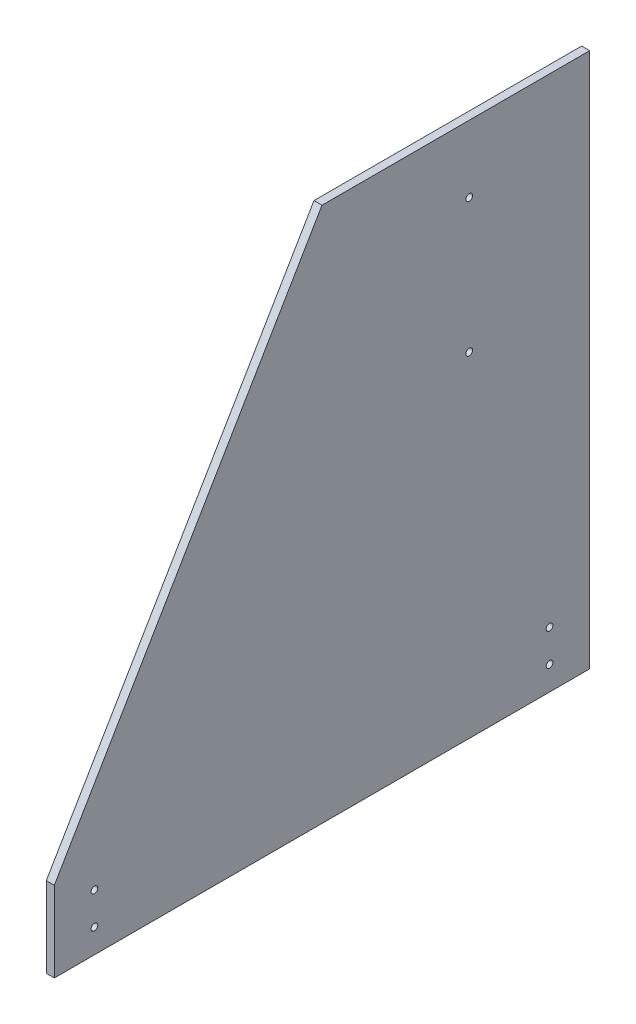
ISO-10303-21;
HEADER;
FILE_DESCRIPTION(('STEP AP214'),'2;1');
FILE_NAME('part.step','',(''),(''),'','','');
FILE_SCHEMA(('AUTOMOTIVE_DESIGN { 1 0 10303 214 1 1 1 1 }'));
ENDSEC;
DATA;
#1=APPLICATION_CONTEXT('core data for automotive mechanical design processes');
#2=APPLICATION_PROTOCOL_DEFINITION('international standard','automotive_design',2000,#1);
#3=PRODUCT_CONTEXT('',#1,'mechanical');
#4=PRODUCT('Part','Part','',(#3));
#5=PRODUCT_RELATED_PRODUCT_CATEGORY('part','',(#4));
#6=PRODUCT_DEFINITION_FORMATION('','',#4);
#7=PRODUCT_DEFINITION_CONTEXT('part definition',#1,'design');
#8=PRODUCT_DEFINITION('design','',#6,#7);
#9=PRODUCT_DEFINITION_SHAPE('','',#8);
#10=(LENGTH_UNIT() NAMED_UNIT(*) SI_UNIT(.MILLI.,.METRE.));
#11=(NAMED_UNIT(*) PLANE_ANGLE_UNIT() SI_UNIT($,.RADIAN.));
#12=(NAMED_UNIT(*) SI_UNIT($,.STERADIAN.) SOLID_ANGLE_UNIT());
#13=UNCERTAINTY_MEASURE_WITH_UNIT(LENGTH_MEASURE(1.E-05),#10,'distance_accuracy_value','');
#14=(GEOMETRIC_REPRESENTATION_CONTEXT(3) GLOBAL_UNCERTAINTY_ASSIGNED_CONTEXT((#13)) GLOBAL_UNIT_ASSIGNED_CONTEXT((#10,
#11,#12)) REPRESENTATION_CONTEXT('',''));
#15=CARTESIAN_POINT('',(0.,0.,0.));
#16=DIRECTION('',(0.,0.,1.));
#17=DIRECTION('',(1.,0.,0.));
#18=AXIS2_PLACEMENT_3D('',#15,#16,#17);
#19=CARTESIAN_POINT('',(6.,0.,0.));
#20=DIRECTION('',(1.,0.,0.));
#21=DIRECTION('',(0.,0.,-1.));
#22=AXIS2_PLACEMENT_3D('',#19,#20,#21);
#23=PLANE('',#22);
#24=CARTESIAN_POINT('',(6.,350.,-310.));
#25=DIRECTION('',(1.,0.,0.));
#26=DIRECTION('',(0.,0.,-1.));
#27=AXIS2_PLACEMENT_3D('',#24,#25,#26);
#28=CIRCLE('',#27,2.50000000000002);
#29=CARTESIAN_POINT('',(6.,350.,-312.5));
#30=VERTEX_POINT('',#29);
#31=EDGE_CURVE('E184',#30,#30,#28,.T.);
#32=ORIENTED_EDGE('',*,*,#31,.F.);
#33=EDGE_LOOP('',(#32));
#34=FACE_BOUND('',#33,.T.);
#35=CARTESIAN_POINT('',(6.,18.0000000000013,-370.));
#36=DIRECTION('',(1.,0.,0.));
#37=DIRECTION('',(0.,0.,-1.));
#38=AXIS2_PLACEMENT_3D('',#35,#36,#37);
#39=CIRCLE('',#38,2.49999999999997);
#40=CARTESIAN_POINT('',(6.,18.0000000000013,-372.5));
#41=VERTEX_POINT('',#40);
#42=EDGE_CURVE('E196',#41,#41,#39,.T.);
#43=ORIENTED_EDGE('',*,*,#42,.F.);
#44=EDGE_LOOP('',(#43));
#45=FACE_BOUND('',#44,.T.);
#46=CARTESIAN_POINT('',(6.,42.,-30.));
#47=DIRECTION('',(1.,0.,0.));
#48=DIRECTION('',(0.,0.,-1.));
#49=AXIS2_PLACEMENT_3D('',#46,#47,#48);
#50=CIRCLE('',#49,2.5);
#51=CARTESIAN_POINT('',(6.,42.,-32.5));
#52=VERTEX_POINT('',#51);
#53=EDGE_CURVE('E116',#52,#52,#50,.T.);
#54=ORIENTED_EDGE('',*,*,#53,.F.);
#55=EDGE_LOOP('',(#54));
#56=FACE_BOUND('',#55,.T.);
#57=DIRECTION('',(0.,-1.,0.));
#58=VECTOR('',#57,1.);
#59=CARTESIAN_POINT('',(6.,60.,0.));
#60=LINE('',#59,#58);
#61=CARTESIAN_POINT('',(6.,60.,0.));
#62=VERTEX_POINT('',#61);
#63=CARTESIAN_POINT('',(6.,0.,0.));
#64=VERTEX_POINT('',#63);
#65=EDGE_CURVE('E121',#62,#64,#60,.T.);
#66=ORIENTED_EDGE('',*,*,#65,.T.);
#67=DIRECTION('',(0.,0.,-1.));
#68=VECTOR('',#67,1.);
#69=CARTESIAN_POINT('',(6.,0.,0.));
#70=LINE('',#69,#68);
#71=CARTESIAN_POINT('',(6.,0.,-400.));
#72=VERTEX_POINT('',#71);
#73=EDGE_CURVE('E88',#64,#72,#70,.T.);
#74=ORIENTED_EDGE('',*,*,#73,.T.);
#75=DIRECTION('',(0.,1.,0.));
#76=VECTOR('',#75,1.);
#77=CARTESIAN_POINT('',(6.,0.,-400.));
#78=LINE('',#77,#76);
#79=CARTESIAN_POINT('',(6.,400.,-400.));
#80=VERTEX_POINT('',#79);
#81=EDGE_CURVE('E92',#72,#80,#78,.T.);
#82=ORIENTED_EDGE('',*,*,#81,.T.);
#83=DIRECTION('',(0.,0.,1.));
#84=VECTOR('',#83,1.);
#85=CARTESIAN_POINT('',(6.,400.,-200.));
#86=LINE('',#85,#84);
#87=CARTESIAN_POINT('',(6.,400.,-200.));
#88=VERTEX_POINT('',#87);
#89=EDGE_CURVE('E96',#80,#88,#86,.T.);
#90=ORIENTED_EDGE('',*,*,#89,.T.);
#91=DIRECTION('',(0.,-0.86193421515777,0.507020126563394));
#92=VECTOR('',#91,1.);
#93=CARTESIAN_POINT('',(6.,60.,0.));
#94=LINE('',#93,#92);
#95=EDGE_CURVE('E54',#88,#62,#94,.T.);
#96=ORIENTED_EDGE('',*,*,#95,.T.);
#97=EDGE_LOOP('',(#66,#74,#82,#90,#96));
#98=FACE_BOUND('',#97,.T.);
#99=CARTESIAN_POINT('',(6.,18.,-30.));
#100=DIRECTION('',(1.,0.,0.));
#101=DIRECTION('',(0.,0.,1.));
#102=AXIS2_PLACEMENT_3D('',#99,#100,#101);
#103=CIRCLE('',#102,2.5);
#104=CARTESIAN_POINT('',(6.,18.,-27.5));
#105=VERTEX_POINT('',#104);
#106=EDGE_CURVE('E202',#105,#105,#103,.T.);
#107=ORIENTED_EDGE('',*,*,#106,.F.);
#108=EDGE_LOOP('',(#107));
#109=FACE_BOUND('',#108,.T.);
#110=CARTESIAN_POINT('',(6.,42.0000000000013,-370.));
#111=DIRECTION('',(1.,0.,0.));
#112=DIRECTION('',(0.,0.,1.));
#113=AXIS2_PLACEMENT_3D('',#110,#111,#112);
#114=CIRCLE('',#113,2.49999999999997);
#115=CARTESIAN_POINT('',(6.,42.0000000000013,-367.5));
#116=VERTEX_POINT('',#115);
#117=EDGE_CURVE('E190',#116,#116,#114,.T.);
#118=ORIENTED_EDGE('',*,*,#117,.F.);
#119=EDGE_LOOP('',(#118));
#120=FACE_BOUND('',#119,.T.);
#121=CARTESIAN_POINT('',(6.,250.,-310.));
#122=DIRECTION('',(1.,0.,0.));
#123=DIRECTION('',(0.,0.,-1.));
#124=AXIS2_PLACEMENT_3D('',#121,#122,#123);
#125=CIRCLE('',#124,2.50000000000002);
#126=CARTESIAN_POINT('',(6.,250.,-312.5));
#127=VERTEX_POINT('',#126);
#128=EDGE_CURVE('E175',#127,#127,#125,.T.);
#129=ORIENTED_EDGE('',*,*,#128,.F.);
#130=EDGE_LOOP('',(#129));
#131=FACE_BOUND('',#130,.T.);
#132=ADVANCED_FACE('F37',(#34,#45,#56,#98,#109,#120,#131),#23,.T.);
#133=CARTESIAN_POINT('',(0.,0.,0.));
#134=DIRECTION('',(1.,0.,0.));
#135=DIRECTION('',(0.,0.,-1.));
#136=AXIS2_PLACEMENT_3D('',#133,#134,#135);
#137=PLANE('',#136);
#138=DIRECTION('',(0.,-1.,0.));
#139=VECTOR('',#138,1.);
#140=CARTESIAN_POINT('',(0.,60.,0.));
#141=LINE('',#140,#139);
#142=CARTESIAN_POINT('',(0.,60.,0.));
#143=VERTEX_POINT('',#142);
#144=CARTESIAN_POINT('',(0.,0.,0.));
#145=VERTEX_POINT('',#144);
#146=EDGE_CURVE('E112',#143,#145,#141,.T.);
#147=ORIENTED_EDGE('',*,*,#146,.F.);
#148=DIRECTION('',(0.,-0.86193421515777,0.507020126563394));
#149=VECTOR('',#148,1.);
#150=CARTESIAN_POINT('',(0.,60.,0.));
#151=LINE('',#150,#149);
#152=CARTESIAN_POINT('',(0.,400.,-200.));
#153=VERTEX_POINT('',#152);
#154=EDGE_CURVE('E80',#153,#143,#151,.T.);
#155=ORIENTED_EDGE('',*,*,#154,.F.);
#156=DIRECTION('',(0.,0.,1.));
#157=VECTOR('',#156,1.);
#158=CARTESIAN_POINT('',(0.,400.,-200.));
#159=LINE('',#158,#157);
#160=CARTESIAN_POINT('',(0.,400.,-400.));
#161=VERTEX_POINT('',#160);
#162=EDGE_CURVE('E74',#161,#153,#159,.T.);
#163=ORIENTED_EDGE('',*,*,#162,.F.);
#164=DIRECTION('',(0.,1.,0.));
#165=VECTOR('',#164,1.);
#166=CARTESIAN_POINT('',(0.,0.,-400.));
#167=LINE('',#166,#165);
#168=CARTESIAN_POINT('',(0.,0.,-400.));
#169=VERTEX_POINT('',#168);
#170=EDGE_CURVE('E103',#169,#161,#167,.T.);
#171=ORIENTED_EDGE('',*,*,#170,.F.);
#172=DIRECTION('',(0.,0.,-1.));
#173=VECTOR('',#172,1.);
#174=CARTESIAN_POINT('',(0.,0.,0.));
#175=LINE('',#174,#173);
#176=EDGE_CURVE('E115',#145,#169,#175,.T.);
#177=ORIENTED_EDGE('',*,*,#176,.F.);
#178=EDGE_LOOP('',(#147,#155,#163,#171,#177));
#179=FACE_BOUND('',#178,.T.);
#180=CARTESIAN_POINT('',(0.,42.,-30.));
#181=DIRECTION('',(1.,0.,0.));
#182=DIRECTION('',(0.,0.,-1.));
#183=AXIS2_PLACEMENT_3D('',#180,#181,#182);
#184=CIRCLE('',#183,2.5);
#185=CARTESIAN_POINT('',(0.,42.,-32.5));
#186=VERTEX_POINT('',#185);
#187=EDGE_CURVE('E205',#186,#186,#184,.T.);
#188=ORIENTED_EDGE('',*,*,#187,.T.);
#189=EDGE_LOOP('',(#188));
#190=FACE_BOUND('',#189,.T.);
#191=CARTESIAN_POINT('',(0.,18.,-30.));
#192=DIRECTION('',(1.,0.,0.));
#193=DIRECTION('',(0.,0.,1.));
#194=AXIS2_PLACEMENT_3D('',#191,#192,#193);
#195=CIRCLE('',#194,2.5);
#196=CARTESIAN_POINT('',(0.,18.,-27.5));
#197=VERTEX_POINT('',#196);
#198=EDGE_CURVE('E199',#197,#197,#195,.T.);
#199=ORIENTED_EDGE('',*,*,#198,.T.);
#200=EDGE_LOOP('',(#199));
#201=FACE_BOUND('',#200,.T.);
#202=CARTESIAN_POINT('',(0.,18.0000000000013,-370.));
#203=DIRECTION('',(1.,0.,0.));
#204=DIRECTION('',(0.,0.,-1.));
#205=AXIS2_PLACEMENT_3D('',#202,#203,#204);
#206=CIRCLE('',#205,2.49999999999997);
#207=CARTESIAN_POINT('',(0.,18.0000000000013,-372.5));
#208=VERTEX_POINT('',#207);
#209=EDGE_CURVE('E193',#208,#208,#206,.T.);
#210=ORIENTED_EDGE('',*,*,#209,.T.);
#211=EDGE_LOOP('',(#210));
#212=FACE_BOUND('',#211,.T.);
#213=CARTESIAN_POINT('',(0.,42.0000000000013,-370.));
#214=DIRECTION('',(1.,0.,0.));
#215=DIRECTION('',(0.,0.,1.));
#216=AXIS2_PLACEMENT_3D('',#213,#214,#215);
#217=CIRCLE('',#216,2.49999999999997);
#218=CARTESIAN_POINT('',(0.,42.0000000000013,-367.5));
#219=VERTEX_POINT('',#218);
#220=EDGE_CURVE('E187',#219,#219,#217,.T.);
#221=ORIENTED_EDGE('',*,*,#220,.T.);
#222=EDGE_LOOP('',(#221));
#223=FACE_BOUND('',#222,.T.);
#224=CARTESIAN_POINT('',(0.,350.,-310.));
#225=DIRECTION('',(1.,0.,0.));
#226=DIRECTION('',(0.,0.,-1.));
#227=AXIS2_PLACEMENT_3D('',#224,#225,#226);
#228=CIRCLE('',#227,2.50000000000002);
#229=CARTESIAN_POINT('',(0.,350.,-312.5));
#230=VERTEX_POINT('',#229);
#231=EDGE_CURVE('E181',#230,#230,#228,.T.);
#232=ORIENTED_EDGE('',*,*,#231,.T.);
#233=EDGE_LOOP('',(#232));
#234=FACE_BOUND('',#233,.T.);
#235=CARTESIAN_POINT('',(0.,250.,-310.));
#236=DIRECTION('',(1.,0.,0.));
#237=DIRECTION('',(0.,0.,-1.));
#238=AXIS2_PLACEMENT_3D('',#235,#236,#237);
#239=CIRCLE('',#238,2.50000000000002);
#240=CARTESIAN_POINT('',(0.,250.,-312.5));
#241=VERTEX_POINT('',#240);
#242=EDGE_CURVE('E178',#241,#241,#239,.T.);
#243=ORIENTED_EDGE('',*,*,#242,.T.);
#244=EDGE_LOOP('',(#243));
#245=FACE_BOUND('',#244,.T.);
#246=ADVANCED_FACE('F125',(#179,#190,#201,#212,#223,#234,#245),#137,.F.);
#247=CARTESIAN_POINT('',(6.,60.,0.));
#248=DIRECTION('',(0.,0.,-1.));
#249=DIRECTION('',(-1.,0.,0.));
#250=AXIS2_PLACEMENT_3D('',#247,#248,#249);
#251=PLANE('',#250);
#252=ORIENTED_EDGE('',*,*,#146,.T.);
#253=DIRECTION('',(-1.,0.,0.));
#254=VECTOR('',#253,1.);
#255=CARTESIAN_POINT('',(6.,0.,0.));
#256=LINE('',#255,#254);
#257=EDGE_CURVE('E11',#64,#145,#256,.T.);
#258=ORIENTED_EDGE('',*,*,#257,.F.);
#259=ORIENTED_EDGE('',*,*,#65,.F.);
#260=DIRECTION('',(-1.,0.,0.));
#261=VECTOR('',#260,1.);
#262=CARTESIAN_POINT('',(6.,60.,0.));
#263=LINE('',#262,#261);
#264=EDGE_CURVE('E108',#62,#143,#263,.T.);
#265=ORIENTED_EDGE('',*,*,#264,.T.);
#266=EDGE_LOOP('',(#252,#258,#259,#265));
#267=FACE_BOUND('',#266,.T.);
#268=ADVANCED_FACE('F39',(#267),#251,.F.);
#269=CARTESIAN_POINT('',(6.,0.,0.));
#270=DIRECTION('',(0.,1.,0.));
#271=DIRECTION('',(0.,0.,1.));
#272=AXIS2_PLACEMENT_3D('',#269,#270,#271);
#273=PLANE('',#272);
#274=ORIENTED_EDGE('',*,*,#176,.T.);
#275=DIRECTION('',(-1.,0.,0.));
#276=VECTOR('',#275,1.);
#277=CARTESIAN_POINT('',(6.,0.,-400.));
#278=LINE('',#277,#276);
#279=EDGE_CURVE('E46',#72,#169,#278,.T.);
#280=ORIENTED_EDGE('',*,*,#279,.F.);
#281=ORIENTED_EDGE('',*,*,#73,.F.);
#282=ORIENTED_EDGE('',*,*,#257,.T.);
#283=EDGE_LOOP('',(#274,#280,#281,#282));
#284=FACE_BOUND('',#283,.T.);
#285=ADVANCED_FACE('F272',(#284),#273,.F.);
#286=CARTESIAN_POINT('',(6.,0.,-400.));
#287=DIRECTION('',(0.,0.,1.));
#288=DIRECTION('',(1.,0.,0.));
#289=AXIS2_PLACEMENT_3D('',#286,#287,#288);
#290=PLANE('',#289);
#291=ORIENTED_EDGE('',*,*,#170,.T.);
#292=DIRECTION('',(-1.,0.,0.));
#293=VECTOR('',#292,1.);
#294=CARTESIAN_POINT('',(6.,400.,-400.));
#295=LINE('',#294,#293);
#296=EDGE_CURVE('E100',#80,#161,#295,.T.);
#297=ORIENTED_EDGE('',*,*,#296,.F.);
#298=ORIENTED_EDGE('',*,*,#81,.F.);
#299=ORIENTED_EDGE('',*,*,#279,.T.);
#300=EDGE_LOOP('',(#291,#297,#298,#299));
#301=FACE_BOUND('',#300,.T.);
#302=ADVANCED_FACE('F101',(#301),#290,.F.);
#303=CARTESIAN_POINT('',(6.,400.,-200.));
#304=DIRECTION('',(0.,-1.,0.));
#305=DIRECTION('',(0.,0.,-1.));
#306=AXIS2_PLACEMENT_3D('',#303,#304,#305);
#307=PLANE('',#306);
#308=ORIENTED_EDGE('',*,*,#162,.T.);
#309=DIRECTION('',(-1.,0.,0.));
#310=VECTOR('',#309,1.);
#311=CARTESIAN_POINT('',(6.,400.,-200.));
#312=LINE('',#311,#310);
#313=EDGE_CURVE('E104',#88,#153,#312,.T.);
#314=ORIENTED_EDGE('',*,*,#313,.F.);
#315=ORIENTED_EDGE('',*,*,#89,.F.);
#316=ORIENTED_EDGE('',*,*,#296,.T.);
#317=EDGE_LOOP('',(#308,#314,#315,#316));
#318=FACE_BOUND('',#317,.T.);
#319=ADVANCED_FACE('F106',(#318),#307,.F.);
#320=CARTESIAN_POINT('',(6.,60.,0.));
#321=DIRECTION('',(0.,-0.507020126563394,-0.86193421515777));
#322=DIRECTION('',(0.,0.86193421515777,-0.507020126563394));
#323=AXIS2_PLACEMENT_3D('',#320,#321,#322);
#324=PLANE('',#323);
#325=ORIENTED_EDGE('',*,*,#154,.T.);
#326=ORIENTED_EDGE('',*,*,#264,.F.);
#327=ORIENTED_EDGE('',*,*,#95,.F.);
#328=ORIENTED_EDGE('',*,*,#313,.T.);
#329=EDGE_LOOP('',(#325,#326,#327,#328));
#330=FACE_BOUND('',#329,.T.);
#331=ADVANCED_FACE('F130',(#330),#324,.F.);
#332=CARTESIAN_POINT('',(6.,42.,-30.));
#333=DIRECTION('',(-1.,0.,0.));
#334=DIRECTION('',(0.,0.,1.));
#335=AXIS2_PLACEMENT_3D('',#332,#333,#334);
#336=CYLINDRICAL_SURFACE('',#335,2.5);
#337=ORIENTED_EDGE('',*,*,#53,.T.);
#338=EDGE_LOOP('',(#337));
#339=FACE_BOUND('',#338,.T.);
#340=ORIENTED_EDGE('',*,*,#187,.F.);
#341=EDGE_LOOP('',(#340));
#342=FACE_BOUND('',#341,.T.);
#343=ADVANCED_FACE('F132',(#339,#342),#336,.F.);
#344=CARTESIAN_POINT('',(6.,18.,-30.));
#345=DIRECTION('',(-1.,0.,0.));
#346=DIRECTION('',(0.,0.,1.));
#347=AXIS2_PLACEMENT_3D('',#344,#345,#346);
#348=CYLINDRICAL_SURFACE('',#347,2.5);
#349=ORIENTED_EDGE('',*,*,#106,.T.);
#350=EDGE_LOOP('',(#349));
#351=FACE_BOUND('',#350,.T.);
#352=ORIENTED_EDGE('',*,*,#198,.F.);
#353=EDGE_LOOP('',(#352));
#354=FACE_BOUND('',#353,.T.);
#355=ADVANCED_FACE('F138',(#351,#354),#348,.F.);
#356=CARTESIAN_POINT('',(6.,18.0000000000013,-370.));
#357=DIRECTION('',(-1.,0.,0.));
#358=DIRECTION('',(0.,0.,1.));
#359=AXIS2_PLACEMENT_3D('',#356,#357,#358);
#360=CYLINDRICAL_SURFACE('',#359,2.49999999999997);
#361=ORIENTED_EDGE('',*,*,#42,.T.);
#362=EDGE_LOOP('',(#361));
#363=FACE_BOUND('',#362,.T.);
#364=ORIENTED_EDGE('',*,*,#209,.F.);
#365=EDGE_LOOP('',(#364));
#366=FACE_BOUND('',#365,.T.);
#367=ADVANCED_FACE('F154',(#363,#366),#360,.F.);
#368=CARTESIAN_POINT('',(6.,42.0000000000013,-370.));
#369=DIRECTION('',(-1.,0.,0.));
#370=DIRECTION('',(0.,0.,1.));
#371=AXIS2_PLACEMENT_3D('',#368,#369,#370);
#372=CYLINDRICAL_SURFACE('',#371,2.49999999999997);
#373=ORIENTED_EDGE('',*,*,#117,.T.);
#374=EDGE_LOOP('',(#373));
#375=FACE_BOUND('',#374,.T.);
#376=ORIENTED_EDGE('',*,*,#220,.F.);
#377=EDGE_LOOP('',(#376));
#378=FACE_BOUND('',#377,.T.);
#379=ADVANCED_FACE('F158',(#375,#378),#372,.F.);
#380=CARTESIAN_POINT('',(6.,350.,-310.));
#381=DIRECTION('',(-1.,0.,0.));
#382=DIRECTION('',(0.,0.,1.));
#383=AXIS2_PLACEMENT_3D('',#380,#381,#382);
#384=CYLINDRICAL_SURFACE('',#383,2.50000000000002);
#385=ORIENTED_EDGE('',*,*,#31,.T.);
#386=EDGE_LOOP('',(#385));
#387=FACE_BOUND('',#386,.T.);
#388=ORIENTED_EDGE('',*,*,#231,.F.);
#389=EDGE_LOOP('',(#388));
#390=FACE_BOUND('',#389,.T.);
#391=ADVANCED_FACE('F162',(#387,#390),#384,.F.);
#392=CARTESIAN_POINT('',(6.,250.,-310.));
#393=DIRECTION('',(-1.,0.,0.));
#394=DIRECTION('',(0.,0.,1.));
#395=AXIS2_PLACEMENT_3D('',#392,#393,#394);
#396=CYLINDRICAL_SURFACE('',#395,2.50000000000002);
#397=ORIENTED_EDGE('',*,*,#128,.T.);
#398=EDGE_LOOP('',(#397));
#399=FACE_BOUND('',#398,.T.);
#400=ORIENTED_EDGE('',*,*,#242,.F.);
#401=EDGE_LOOP('',(#400));
#402=FACE_BOUND('',#401,.T.);
#403=ADVANCED_FACE('F166',(#399,#402),#396,.F.);
#404=CLOSED_SHELL('',(#132,#246,#268,#285,#302,#319,#331,#343,#355,#367,#379,#391,#403));
#405=MANIFOLD_SOLID_BREP('B2',#404);
#406=ADVANCED_BREP_SHAPE_REPRESENTATION('',(#18,#405),#14);
#407=SHAPE_DEFINITION_REPRESENTATION(#9,#406);
ENDSEC;
END-ISO-10303-21;
